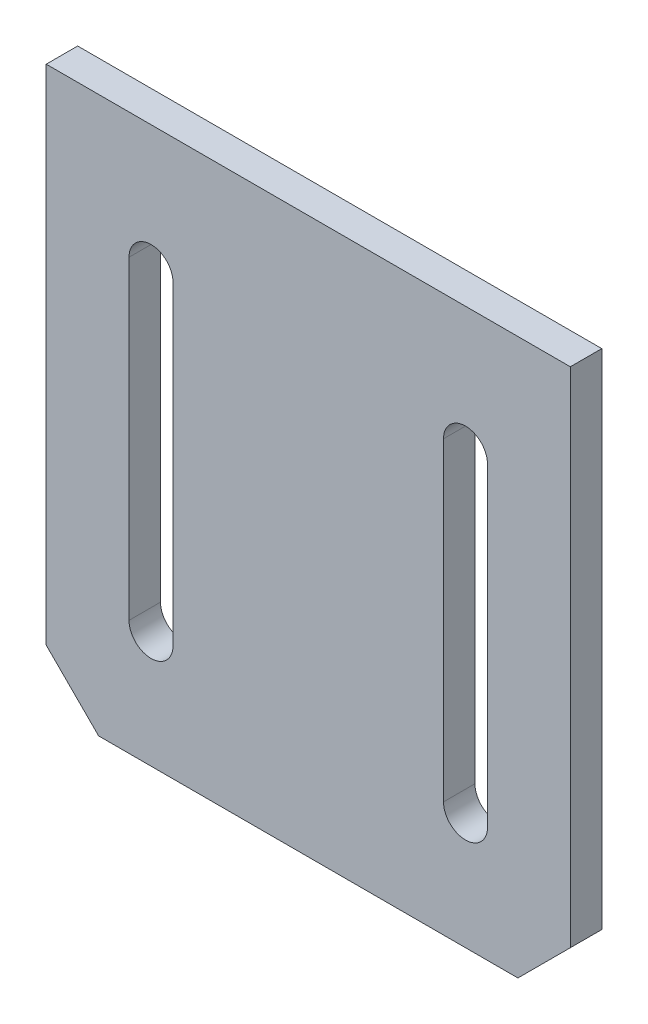
ISO-10303-21;
HEADER;
FILE_DESCRIPTION(('STEP AP214'),'2;1');
FILE_NAME('part.step','',(''),(''),'','','');
FILE_SCHEMA(('AUTOMOTIVE_DESIGN { 1 0 10303 214 1 1 1 1 }'));
ENDSEC;
DATA;
#1=APPLICATION_CONTEXT('core data for automotive mechanical design processes');
#2=APPLICATION_PROTOCOL_DEFINITION('international standard','automotive_design',2000,#1);
#3=PRODUCT_CONTEXT('',#1,'mechanical');
#4=PRODUCT('Part','Part','',(#3));
#5=PRODUCT_RELATED_PRODUCT_CATEGORY('part','',(#4));
#6=PRODUCT_DEFINITION_FORMATION('','',#4);
#7=PRODUCT_DEFINITION_CONTEXT('part definition',#1,'design');
#8=PRODUCT_DEFINITION('design','',#6,#7);
#9=PRODUCT_DEFINITION_SHAPE('','',#8);
#10=(LENGTH_UNIT() NAMED_UNIT(*) SI_UNIT(.MILLI.,.METRE.));
#11=(NAMED_UNIT(*) PLANE_ANGLE_UNIT() SI_UNIT($,.RADIAN.));
#12=(NAMED_UNIT(*) SI_UNIT($,.STERADIAN.) SOLID_ANGLE_UNIT());
#13=UNCERTAINTY_MEASURE_WITH_UNIT(LENGTH_MEASURE(1.E-05),#10,'distance_accuracy_value','');
#14=(GEOMETRIC_REPRESENTATION_CONTEXT(3) GLOBAL_UNCERTAINTY_ASSIGNED_CONTEXT((#13)) GLOBAL_UNIT_ASSIGNED_CONTEXT((#10,
#11,#12)) REPRESENTATION_CONTEXT('',''));
#15=CARTESIAN_POINT('',(0.,0.,0.));
#16=DIRECTION('',(0.,0.,1.));
#17=DIRECTION('',(1.,0.,0.));
#18=AXIS2_PLACEMENT_3D('',#15,#16,#17);
#19=CARTESIAN_POINT('',(0.,0.,3.));
#20=DIRECTION('',(0.,0.,1.));
#21=DIRECTION('',(1.,0.,0.));
#22=AXIS2_PLACEMENT_3D('',#19,#20,#21);
#23=PLANE('',#22);
#24=DIRECTION('',(-1.,0.,0.));
#25=VECTOR('',#24,1.);
#26=CARTESIAN_POINT('',(-25.,26.5,3.));
#27=LINE('',#26,#25);
#28=CARTESIAN_POINT('',(25.,26.5,3.));
#29=VERTEX_POINT('',#28);
#30=CARTESIAN_POINT('',(-25.,26.5,3.));
#31=VERTEX_POINT('',#30);
#32=EDGE_CURVE('E232',#29,#31,#27,.T.);
#33=ORIENTED_EDGE('',*,*,#32,.T.);
#34=DIRECTION('',(0.,-1.,0.));
#35=VECTOR('',#34,1.);
#36=CARTESIAN_POINT('',(-25.,-21.5,3.));
#37=LINE('',#36,#35);
#38=CARTESIAN_POINT('',(-25.,-21.5,3.));
#39=VERTEX_POINT('',#38);
#40=EDGE_CURVE('E236',#31,#39,#37,.T.);
#41=ORIENTED_EDGE('',*,*,#40,.T.);
#42=DIRECTION('',(0.707106781186546,-0.707106781186549,0.));
#43=VECTOR('',#42,1.);
#44=CARTESIAN_POINT('',(-20.,-26.5,3.));
#45=LINE('',#44,#43);
#46=CARTESIAN_POINT('',(-20.,-26.5,3.));
#47=VERTEX_POINT('',#46);
#48=EDGE_CURVE('E240',#39,#47,#45,.T.);
#49=ORIENTED_EDGE('',*,*,#48,.T.);
#50=DIRECTION('',(1.,0.,0.));
#51=VECTOR('',#50,1.);
#52=CARTESIAN_POINT('',(-20.,-26.5,3.));
#53=LINE('',#52,#51);
#54=CARTESIAN_POINT('',(20.,-26.5,3.));
#55=VERTEX_POINT('',#54);
#56=EDGE_CURVE('E243',#47,#55,#53,.T.);
#57=ORIENTED_EDGE('',*,*,#56,.T.);
#58=DIRECTION('',(0.707106781186549,0.707106781186546,0.));
#59=VECTOR('',#58,1.);
#60=CARTESIAN_POINT('',(20.,-26.5,3.));
#61=LINE('',#60,#59);
#62=CARTESIAN_POINT('',(25.,-21.5,3.));
#63=VERTEX_POINT('',#62);
#64=EDGE_CURVE('E246',#55,#63,#61,.T.);
#65=ORIENTED_EDGE('',*,*,#64,.T.);
#66=DIRECTION('',(0.,1.,0.));
#67=VECTOR('',#66,1.);
#68=CARTESIAN_POINT('',(25.,-21.5,3.));
#69=LINE('',#68,#67);
#70=EDGE_CURVE('E249',#63,#29,#69,.T.);
#71=ORIENTED_EDGE('',*,*,#70,.T.);
#72=EDGE_LOOP('',(#33,#41,#49,#57,#65,#71));
#73=FACE_BOUND('',#72,.T.);
#74=DIRECTION('',(0.,-1.,0.));
#75=VECTOR('',#74,1.);
#76=CARTESIAN_POINT('',(12.9,14.5,3.));
#77=LINE('',#76,#75);
#78=CARTESIAN_POINT('',(12.9,14.5,3.));
#79=VERTEX_POINT('',#78);
#80=CARTESIAN_POINT('',(12.9,-15.5,3.));
#81=VERTEX_POINT('',#80);
#82=EDGE_CURVE('E192',#79,#81,#77,.T.);
#83=ORIENTED_EDGE('',*,*,#82,.F.);
#84=CARTESIAN_POINT('',(15.,14.5,3.));
#85=DIRECTION('',(0.,0.,1.));
#86=DIRECTION('',(1.,0.,0.));
#87=AXIS2_PLACEMENT_3D('',#84,#85,#86);
#88=CIRCLE('',#87,2.1);
#89=CARTESIAN_POINT('',(17.1,14.5,3.));
#90=VERTEX_POINT('',#89);
#91=EDGE_CURVE('E189',#90,#79,#88,.T.);
#92=ORIENTED_EDGE('',*,*,#91,.F.);
#93=DIRECTION('',(0.,1.,0.));
#94=VECTOR('',#93,1.);
#95=CARTESIAN_POINT('',(17.1,14.5,3.));
#96=LINE('',#95,#94);
#97=CARTESIAN_POINT('',(17.1,-15.5,3.));
#98=VERTEX_POINT('',#97);
#99=EDGE_CURVE('E200',#98,#90,#96,.T.);
#100=ORIENTED_EDGE('',*,*,#99,.F.);
#101=CARTESIAN_POINT('',(15.,-15.5,3.));
#102=DIRECTION('',(0.,0.,1.));
#103=DIRECTION('',(1.,0.,0.));
#104=AXIS2_PLACEMENT_3D('',#101,#102,#103);
#105=CIRCLE('',#104,2.09999999999999);
#106=EDGE_CURVE('E196',#81,#98,#105,.T.);
#107=ORIENTED_EDGE('',*,*,#106,.F.);
#108=EDGE_LOOP('',(#83,#92,#100,#107));
#109=FACE_BOUND('',#108,.T.);
#110=DIRECTION('',(0.,-1.,0.));
#111=VECTOR('',#110,1.);
#112=CARTESIAN_POINT('',(-17.1,14.5,3.));
#113=LINE('',#112,#111);
#114=CARTESIAN_POINT('',(-17.1,14.5,3.));
#115=VERTEX_POINT('',#114);
#116=CARTESIAN_POINT('',(-17.1,-15.5,3.));
#117=VERTEX_POINT('',#116);
#118=EDGE_CURVE('E150',#115,#117,#113,.T.);
#119=ORIENTED_EDGE('',*,*,#118,.F.);
#120=CARTESIAN_POINT('',(-15.,14.5,3.));
#121=DIRECTION('',(0.,0.,1.));
#122=DIRECTION('',(-1.,0.,0.));
#123=AXIS2_PLACEMENT_3D('',#120,#121,#122);
#124=CIRCLE('',#123,2.1);
#125=CARTESIAN_POINT('',(-12.9,14.5,3.));
#126=VERTEX_POINT('',#125);
#127=EDGE_CURVE('E141',#126,#115,#124,.T.);
#128=ORIENTED_EDGE('',*,*,#127,.F.);
#129=DIRECTION('',(0.,1.,0.));
#130=VECTOR('',#129,1.);
#131=CARTESIAN_POINT('',(-12.9,14.5,3.));
#132=LINE('',#131,#130);
#133=CARTESIAN_POINT('',(-12.9,-15.5,3.));
#134=VERTEX_POINT('',#133);
#135=EDGE_CURVE('E167',#134,#126,#132,.T.);
#136=ORIENTED_EDGE('',*,*,#135,.F.);
#137=CARTESIAN_POINT('',(-15.,-15.5,3.));
#138=DIRECTION('',(0.,0.,1.));
#139=DIRECTION('',(-1.,0.,0.));
#140=AXIS2_PLACEMENT_3D('',#137,#138,#139);
#141=CIRCLE('',#140,2.09999999999999);
#142=EDGE_CURVE('E163',#117,#134,#141,.T.);
#143=ORIENTED_EDGE('',*,*,#142,.F.);
#144=EDGE_LOOP('',(#119,#128,#136,#143));
#145=FACE_BOUND('',#144,.T.);
#146=ADVANCED_FACE('F39',(#73,#109,#145),#23,.T.);
#147=CARTESIAN_POINT('',(0.,0.,0.));
#148=DIRECTION('',(0.,0.,1.));
#149=DIRECTION('',(1.,0.,0.));
#150=AXIS2_PLACEMENT_3D('',#147,#148,#149);
#151=PLANE('',#150);
#152=CARTESIAN_POINT('',(15.,14.5,0.));
#153=DIRECTION('',(0.,0.,1.));
#154=DIRECTION('',(1.,0.,0.));
#155=AXIS2_PLACEMENT_3D('',#152,#153,#154);
#156=CIRCLE('',#155,2.1);
#157=CARTESIAN_POINT('',(17.1,14.5,0.));
#158=VERTEX_POINT('',#157);
#159=CARTESIAN_POINT('',(12.9,14.5,0.));
#160=VERTEX_POINT('',#159);
#161=EDGE_CURVE('E159',#158,#160,#156,.T.);
#162=ORIENTED_EDGE('',*,*,#161,.T.);
#163=DIRECTION('',(0.,-1.,0.));
#164=VECTOR('',#163,1.);
#165=CARTESIAN_POINT('',(12.9,14.5,0.));
#166=LINE('',#165,#164);
#167=CARTESIAN_POINT('',(12.9,-15.5,0.));
#168=VERTEX_POINT('',#167);
#169=EDGE_CURVE('E207',#160,#168,#166,.T.);
#170=ORIENTED_EDGE('',*,*,#169,.T.);
#171=CARTESIAN_POINT('',(15.,-15.5,0.));
#172=DIRECTION('',(0.,0.,1.));
#173=DIRECTION('',(1.,0.,0.));
#174=AXIS2_PLACEMENT_3D('',#171,#172,#173);
#175=CIRCLE('',#174,2.09999999999999);
#176=CARTESIAN_POINT('',(17.1,-15.5,0.));
#177=VERTEX_POINT('',#176);
#178=EDGE_CURVE('E211',#168,#177,#175,.T.);
#179=ORIENTED_EDGE('',*,*,#178,.T.);
#180=DIRECTION('',(0.,1.,0.));
#181=VECTOR('',#180,1.);
#182=CARTESIAN_POINT('',(17.1,14.5,0.));
#183=LINE('',#182,#181);
#184=EDGE_CURVE('E193',#177,#158,#183,.T.);
#185=ORIENTED_EDGE('',*,*,#184,.T.);
#186=EDGE_LOOP('',(#162,#170,#179,#185));
#187=FACE_BOUND('',#186,.T.);
#188=DIRECTION('',(-1.,0.,0.));
#189=VECTOR('',#188,1.);
#190=CARTESIAN_POINT('',(-25.,26.5,0.));
#191=LINE('',#190,#189);
#192=CARTESIAN_POINT('',(25.,26.5,0.));
#193=VERTEX_POINT('',#192);
#194=CARTESIAN_POINT('',(-25.,26.5,0.));
#195=VERTEX_POINT('',#194);
#196=EDGE_CURVE('E231',#193,#195,#191,.T.);
#197=ORIENTED_EDGE('',*,*,#196,.F.);
#198=DIRECTION('',(0.,1.,0.));
#199=VECTOR('',#198,1.);
#200=CARTESIAN_POINT('',(25.,-21.5,0.));
#201=LINE('',#200,#199);
#202=CARTESIAN_POINT('',(25.,-21.5,0.));
#203=VERTEX_POINT('',#202);
#204=EDGE_CURVE('E237',#203,#193,#201,.T.);
#205=ORIENTED_EDGE('',*,*,#204,.F.);
#206=DIRECTION('',(0.707106781186549,0.707106781186546,0.));
#207=VECTOR('',#206,1.);
#208=CARTESIAN_POINT('',(20.,-26.5,0.));
#209=LINE('',#208,#207);
#210=CARTESIAN_POINT('',(20.,-26.5,0.));
#211=VERTEX_POINT('',#210);
#212=EDGE_CURVE('E265',#211,#203,#209,.T.);
#213=ORIENTED_EDGE('',*,*,#212,.F.);
#214=DIRECTION('',(1.,0.,0.));
#215=VECTOR('',#214,1.);
#216=CARTESIAN_POINT('',(-20.,-26.5,0.));
#217=LINE('',#216,#215);
#218=CARTESIAN_POINT('',(-20.,-26.5,0.));
#219=VERTEX_POINT('',#218);
#220=EDGE_CURVE('E262',#219,#211,#217,.T.);
#221=ORIENTED_EDGE('',*,*,#220,.F.);
#222=DIRECTION('',(0.707106781186546,-0.707106781186549,0.));
#223=VECTOR('',#222,1.);
#224=CARTESIAN_POINT('',(-20.,-26.5,0.));
#225=LINE('',#224,#223);
#226=CARTESIAN_POINT('',(-25.,-21.5,0.));
#227=VERTEX_POINT('',#226);
#228=EDGE_CURVE('E259',#227,#219,#225,.T.);
#229=ORIENTED_EDGE('',*,*,#228,.F.);
#230=DIRECTION('',(0.,-1.,0.));
#231=VECTOR('',#230,1.);
#232=CARTESIAN_POINT('',(-25.,-21.5,0.));
#233=LINE('',#232,#231);
#234=EDGE_CURVE('E256',#195,#227,#233,.T.);
#235=ORIENTED_EDGE('',*,*,#234,.F.);
#236=EDGE_LOOP('',(#197,#205,#213,#221,#229,#235));
#237=FACE_BOUND('',#236,.T.);
#238=CARTESIAN_POINT('',(-15.,14.5,0.));
#239=DIRECTION('',(0.,0.,1.));
#240=DIRECTION('',(-1.,0.,0.));
#241=AXIS2_PLACEMENT_3D('',#238,#239,#240);
#242=CIRCLE('',#241,2.1);
#243=CARTESIAN_POINT('',(-12.9,14.5,0.));
#244=VERTEX_POINT('',#243);
#245=CARTESIAN_POINT('',(-17.1,14.5,0.));
#246=VERTEX_POINT('',#245);
#247=EDGE_CURVE('E63',#244,#246,#242,.T.);
#248=ORIENTED_EDGE('',*,*,#247,.T.);
#249=DIRECTION('',(0.,-1.,0.));
#250=VECTOR('',#249,1.);
#251=CARTESIAN_POINT('',(-17.1,14.5,0.));
#252=LINE('',#251,#250);
#253=CARTESIAN_POINT('',(-17.1,-15.5,0.));
#254=VERTEX_POINT('',#253);
#255=EDGE_CURVE('E157',#246,#254,#252,.T.);
#256=ORIENTED_EDGE('',*,*,#255,.T.);
#257=CARTESIAN_POINT('',(-15.,-15.5,0.));
#258=DIRECTION('',(0.,0.,1.));
#259=DIRECTION('',(-1.,0.,0.));
#260=AXIS2_PLACEMENT_3D('',#257,#258,#259);
#261=CIRCLE('',#260,2.09999999999999);
#262=CARTESIAN_POINT('',(-12.9,-15.5,0.));
#263=VERTEX_POINT('',#262);
#264=EDGE_CURVE('E176',#254,#263,#261,.T.);
#265=ORIENTED_EDGE('',*,*,#264,.T.);
#266=DIRECTION('',(0.,1.,0.));
#267=VECTOR('',#266,1.);
#268=CARTESIAN_POINT('',(-12.9,14.5,0.));
#269=LINE('',#268,#267);
#270=EDGE_CURVE('E151',#263,#244,#269,.T.);
#271=ORIENTED_EDGE('',*,*,#270,.T.);
#272=EDGE_LOOP('',(#248,#256,#265,#271));
#273=FACE_BOUND('',#272,.T.);
#274=ADVANCED_FACE('F296',(#187,#237,#273),#151,.F.);
#275=CARTESIAN_POINT('',(-25.,26.5,3.));
#276=DIRECTION('',(0.,-1.,0.));
#277=DIRECTION('',(1.,0.,0.));
#278=AXIS2_PLACEMENT_3D('',#275,#276,#277);
#279=PLANE('',#278);
#280=ORIENTED_EDGE('',*,*,#196,.T.);
#281=DIRECTION('',(0.,0.,-1.));
#282=VECTOR('',#281,1.);
#283=CARTESIAN_POINT('',(-25.,26.5,3.));
#284=LINE('',#283,#282);
#285=EDGE_CURVE('E11',#31,#195,#284,.T.);
#286=ORIENTED_EDGE('',*,*,#285,.F.);
#287=ORIENTED_EDGE('',*,*,#32,.F.);
#288=DIRECTION('',(0.,0.,-1.));
#289=VECTOR('',#288,1.);
#290=CARTESIAN_POINT('',(25.,26.5,3.));
#291=LINE('',#290,#289);
#292=EDGE_CURVE('E252',#29,#193,#291,.T.);
#293=ORIENTED_EDGE('',*,*,#292,.T.);
#294=EDGE_LOOP('',(#280,#286,#287,#293));
#295=FACE_BOUND('',#294,.T.);
#296=ADVANCED_FACE('F41',(#295),#279,.F.);
#297=CARTESIAN_POINT('',(-25.,-21.5,3.));
#298=DIRECTION('',(1.,0.,0.));
#299=DIRECTION('',(0.,1.,0.));
#300=AXIS2_PLACEMENT_3D('',#297,#298,#299);
#301=PLANE('',#300);
#302=ORIENTED_EDGE('',*,*,#234,.T.);
#303=DIRECTION('',(0.,0.,-1.));
#304=VECTOR('',#303,1.);
#305=CARTESIAN_POINT('',(-25.,-21.5,3.));
#306=LINE('',#305,#304);
#307=EDGE_CURVE('E48',#39,#227,#306,.T.);
#308=ORIENTED_EDGE('',*,*,#307,.F.);
#309=ORIENTED_EDGE('',*,*,#40,.F.);
#310=ORIENTED_EDGE('',*,*,#285,.T.);
#311=EDGE_LOOP('',(#302,#308,#309,#310));
#312=FACE_BOUND('',#311,.T.);
#313=ADVANCED_FACE('F314',(#312),#301,.F.);
#314=CARTESIAN_POINT('',(-20.,-26.5,3.));
#315=DIRECTION('',(0.707106781186549,0.707106781186546,0.));
#316=DIRECTION('',(-0.707106781186546,0.707106781186549,0.));
#317=AXIS2_PLACEMENT_3D('',#314,#315,#316);
#318=PLANE('',#317);
#319=ORIENTED_EDGE('',*,*,#228,.T.);
#320=DIRECTION('',(0.,0.,-1.));
#321=VECTOR('',#320,1.);
#322=CARTESIAN_POINT('',(-20.,-26.5,3.));
#323=LINE('',#322,#321);
#324=EDGE_CURVE('E281',#47,#219,#323,.T.);
#325=ORIENTED_EDGE('',*,*,#324,.F.);
#326=ORIENTED_EDGE('',*,*,#48,.F.);
#327=ORIENTED_EDGE('',*,*,#307,.T.);
#328=EDGE_LOOP('',(#319,#325,#326,#327));
#329=FACE_BOUND('',#328,.T.);
#330=ADVANCED_FACE('F290',(#329),#318,.F.);
#331=CARTESIAN_POINT('',(-20.,-26.5,3.));
#332=DIRECTION('',(0.,1.,0.));
#333=DIRECTION('',(-1.,0.,0.));
#334=AXIS2_PLACEMENT_3D('',#331,#332,#333);
#335=PLANE('',#334);
#336=ORIENTED_EDGE('',*,*,#220,.T.);
#337=DIRECTION('',(0.,0.,-1.));
#338=VECTOR('',#337,1.);
#339=CARTESIAN_POINT('',(20.,-26.5,3.));
#340=LINE('',#339,#338);
#341=EDGE_CURVE('E277',#55,#211,#340,.T.);
#342=ORIENTED_EDGE('',*,*,#341,.F.);
#343=ORIENTED_EDGE('',*,*,#56,.F.);
#344=ORIENTED_EDGE('',*,*,#324,.T.);
#345=EDGE_LOOP('',(#336,#342,#343,#344));
#346=FACE_BOUND('',#345,.T.);
#347=ADVANCED_FACE('F302',(#346),#335,.F.);
#348=CARTESIAN_POINT('',(20.,-26.5,3.));
#349=DIRECTION('',(-0.707106781186546,0.707106781186549,0.));
#350=DIRECTION('',(-0.707106781186549,-0.707106781186546,0.));
#351=AXIS2_PLACEMENT_3D('',#348,#349,#350);
#352=PLANE('',#351);
#353=ORIENTED_EDGE('',*,*,#212,.T.);
#354=DIRECTION('',(0.,0.,-1.));
#355=VECTOR('',#354,1.);
#356=CARTESIAN_POINT('',(25.,-21.5,3.));
#357=LINE('',#356,#355);
#358=EDGE_CURVE('E273',#63,#203,#357,.T.);
#359=ORIENTED_EDGE('',*,*,#358,.F.);
#360=ORIENTED_EDGE('',*,*,#64,.F.);
#361=ORIENTED_EDGE('',*,*,#341,.T.);
#362=EDGE_LOOP('',(#353,#359,#360,#361));
#363=FACE_BOUND('',#362,.T.);
#364=ADVANCED_FACE('F306',(#363),#352,.F.);
#365=CARTESIAN_POINT('',(25.,-21.5,3.));
#366=DIRECTION('',(-1.,0.,0.));
#367=DIRECTION('',(0.,-1.,0.));
#368=AXIS2_PLACEMENT_3D('',#365,#366,#367);
#369=PLANE('',#368);
#370=ORIENTED_EDGE('',*,*,#204,.T.);
#371=ORIENTED_EDGE('',*,*,#292,.F.);
#372=ORIENTED_EDGE('',*,*,#70,.F.);
#373=ORIENTED_EDGE('',*,*,#358,.T.);
#374=EDGE_LOOP('',(#370,#371,#372,#373));
#375=FACE_BOUND('',#374,.T.);
#376=ADVANCED_FACE('F317',(#375),#369,.F.);
#377=CARTESIAN_POINT('',(15.,14.5,3.));
#378=DIRECTION('',(0.,0.,-1.));
#379=DIRECTION('',(-1.,0.,0.));
#380=AXIS2_PLACEMENT_3D('',#377,#378,#379);
#381=CYLINDRICAL_SURFACE('',#380,2.1);
#382=ORIENTED_EDGE('',*,*,#161,.F.);
#383=DIRECTION('',(0.,0.,-1.));
#384=VECTOR('',#383,1.);
#385=CARTESIAN_POINT('',(17.1,14.5,3.));
#386=LINE('',#385,#384);
#387=EDGE_CURVE('E203',#90,#158,#386,.T.);
#388=ORIENTED_EDGE('',*,*,#387,.F.);
#389=ORIENTED_EDGE('',*,*,#91,.T.);
#390=DIRECTION('',(0.,0.,-1.));
#391=VECTOR('',#390,1.);
#392=CARTESIAN_POINT('',(12.9,14.5,3.));
#393=LINE('',#392,#391);
#394=EDGE_CURVE('E227',#79,#160,#393,.T.);
#395=ORIENTED_EDGE('',*,*,#394,.T.);
#396=EDGE_LOOP('',(#382,#388,#389,#395));
#397=FACE_BOUND('',#396,.T.);
#398=ADVANCED_FACE('F319',(#397),#381,.F.);
#399=CARTESIAN_POINT('',(12.9,14.5,3.));
#400=DIRECTION('',(1.,0.,0.));
#401=DIRECTION('',(0.,1.,0.));
#402=AXIS2_PLACEMENT_3D('',#399,#400,#401);
#403=PLANE('',#402);
#404=ORIENTED_EDGE('',*,*,#169,.F.);
#405=ORIENTED_EDGE('',*,*,#394,.F.);
#406=ORIENTED_EDGE('',*,*,#82,.T.);
#407=DIRECTION('',(0.,0.,-1.));
#408=VECTOR('',#407,1.);
#409=CARTESIAN_POINT('',(12.9,-15.5,3.));
#410=LINE('',#409,#408);
#411=EDGE_CURVE('E224',#81,#168,#410,.T.);
#412=ORIENTED_EDGE('',*,*,#411,.T.);
#413=EDGE_LOOP('',(#404,#405,#406,#412));
#414=FACE_BOUND('',#413,.T.);
#415=ADVANCED_FACE('F325',(#414),#403,.T.);
#416=CARTESIAN_POINT('',(15.,-15.5,3.));
#417=DIRECTION('',(0.,0.,-1.));
#418=DIRECTION('',(-1.,0.,0.));
#419=AXIS2_PLACEMENT_3D('',#416,#417,#418);
#420=CYLINDRICAL_SURFACE('',#419,2.09999999999999);
#421=ORIENTED_EDGE('',*,*,#178,.F.);
#422=ORIENTED_EDGE('',*,*,#411,.F.);
#423=ORIENTED_EDGE('',*,*,#106,.T.);
#424=DIRECTION('',(0.,0.,-1.));
#425=VECTOR('',#424,1.);
#426=CARTESIAN_POINT('',(17.1,-15.5,3.));
#427=LINE('',#426,#425);
#428=EDGE_CURVE('E221',#98,#177,#427,.T.);
#429=ORIENTED_EDGE('',*,*,#428,.T.);
#430=EDGE_LOOP('',(#421,#422,#423,#429));
#431=FACE_BOUND('',#430,.T.);
#432=ADVANCED_FACE('F339',(#431),#420,.F.);
#433=CARTESIAN_POINT('',(17.1,14.5,3.));
#434=DIRECTION('',(-1.,0.,0.));
#435=DIRECTION('',(0.,-1.,0.));
#436=AXIS2_PLACEMENT_3D('',#433,#434,#435);
#437=PLANE('',#436);
#438=ORIENTED_EDGE('',*,*,#184,.F.);
#439=ORIENTED_EDGE('',*,*,#428,.F.);
#440=ORIENTED_EDGE('',*,*,#99,.T.);
#441=ORIENTED_EDGE('',*,*,#387,.T.);
#442=EDGE_LOOP('',(#438,#439,#440,#441));
#443=FACE_BOUND('',#442,.T.);
#444=ADVANCED_FACE('F343',(#443),#437,.T.);
#445=CARTESIAN_POINT('',(-15.,14.5,3.));
#446=DIRECTION('',(0.,0.,-1.));
#447=DIRECTION('',(-1.,0.,0.));
#448=AXIS2_PLACEMENT_3D('',#445,#446,#447);
#449=CYLINDRICAL_SURFACE('',#448,2.1);
#450=ORIENTED_EDGE('',*,*,#247,.F.);
#451=DIRECTION('',(0.,0.,-1.));
#452=VECTOR('',#451,1.);
#453=CARTESIAN_POINT('',(-12.9,14.5,3.));
#454=LINE('',#453,#452);
#455=EDGE_CURVE('E145',#126,#244,#454,.T.);
#456=ORIENTED_EDGE('',*,*,#455,.F.);
#457=ORIENTED_EDGE('',*,*,#127,.T.);
#458=DIRECTION('',(0.,0.,-1.));
#459=VECTOR('',#458,1.);
#460=CARTESIAN_POINT('',(-17.1,14.5,3.));
#461=LINE('',#460,#459);
#462=EDGE_CURVE('E144',#115,#246,#461,.T.);
#463=ORIENTED_EDGE('',*,*,#462,.T.);
#464=EDGE_LOOP('',(#450,#456,#457,#463));
#465=FACE_BOUND('',#464,.T.);
#466=ADVANCED_FACE('F143',(#465),#449,.F.);
#467=CARTESIAN_POINT('',(-17.1,14.5,3.));
#468=DIRECTION('',(1.,0.,0.));
#469=DIRECTION('',(0.,1.,0.));
#470=AXIS2_PLACEMENT_3D('',#467,#468,#469);
#471=PLANE('',#470);
#472=ORIENTED_EDGE('',*,*,#255,.F.);
#473=ORIENTED_EDGE('',*,*,#462,.F.);
#474=ORIENTED_EDGE('',*,*,#118,.T.);
#475=DIRECTION('',(0.,0.,-1.));
#476=VECTOR('',#475,1.);
#477=CARTESIAN_POINT('',(-17.1,-15.5,3.));
#478=LINE('',#477,#476);
#479=EDGE_CURVE('E160',#117,#254,#478,.T.);
#480=ORIENTED_EDGE('',*,*,#479,.T.);
#481=EDGE_LOOP('',(#472,#473,#474,#480));
#482=FACE_BOUND('',#481,.T.);
#483=ADVANCED_FACE('F154',(#482),#471,.T.);
#484=CARTESIAN_POINT('',(-15.,-15.5,3.));
#485=DIRECTION('',(0.,0.,-1.));
#486=DIRECTION('',(-1.,0.,0.));
#487=AXIS2_PLACEMENT_3D('',#484,#485,#486);
#488=CYLINDRICAL_SURFACE('',#487,2.09999999999999);
#489=ORIENTED_EDGE('',*,*,#264,.F.);
#490=ORIENTED_EDGE('',*,*,#479,.F.);
#491=ORIENTED_EDGE('',*,*,#142,.T.);
#492=DIRECTION('',(0.,0.,-1.));
#493=VECTOR('',#492,1.);
#494=CARTESIAN_POINT('',(-12.9,-15.5,3.));
#495=LINE('',#494,#493);
#496=EDGE_CURVE('E55',#134,#263,#495,.T.);
#497=ORIENTED_EDGE('',*,*,#496,.T.);
#498=EDGE_LOOP('',(#489,#490,#491,#497));
#499=FACE_BOUND('',#498,.T.);
#500=ADVANCED_FACE('F352',(#499),#488,.F.);
#501=CARTESIAN_POINT('',(-12.9,14.5,3.));
#502=DIRECTION('',(-1.,0.,0.));
#503=DIRECTION('',(0.,-1.,0.));
#504=AXIS2_PLACEMENT_3D('',#501,#502,#503);
#505=PLANE('',#504);
#506=ORIENTED_EDGE('',*,*,#270,.F.);
#507=ORIENTED_EDGE('',*,*,#496,.F.);
#508=ORIENTED_EDGE('',*,*,#135,.T.);
#509=ORIENTED_EDGE('',*,*,#455,.T.);
#510=EDGE_LOOP('',(#506,#507,#508,#509));
#511=FACE_BOUND('',#510,.T.);
#512=ADVANCED_FACE('F355',(#511),#505,.T.);
#513=CLOSED_SHELL('',(#146,#274,#296,#313,#330,#347,#364,#376,#398,#415,#432,#444,#466,#483,
#500,#512));
#514=MANIFOLD_SOLID_BREP('B2',#513);
#515=ADVANCED_BREP_SHAPE_REPRESENTATION('',(#18,#514),#14);
#516=SHAPE_DEFINITION_REPRESENTATION(#9,#515);
ENDSEC;
END-ISO-10303-21;
